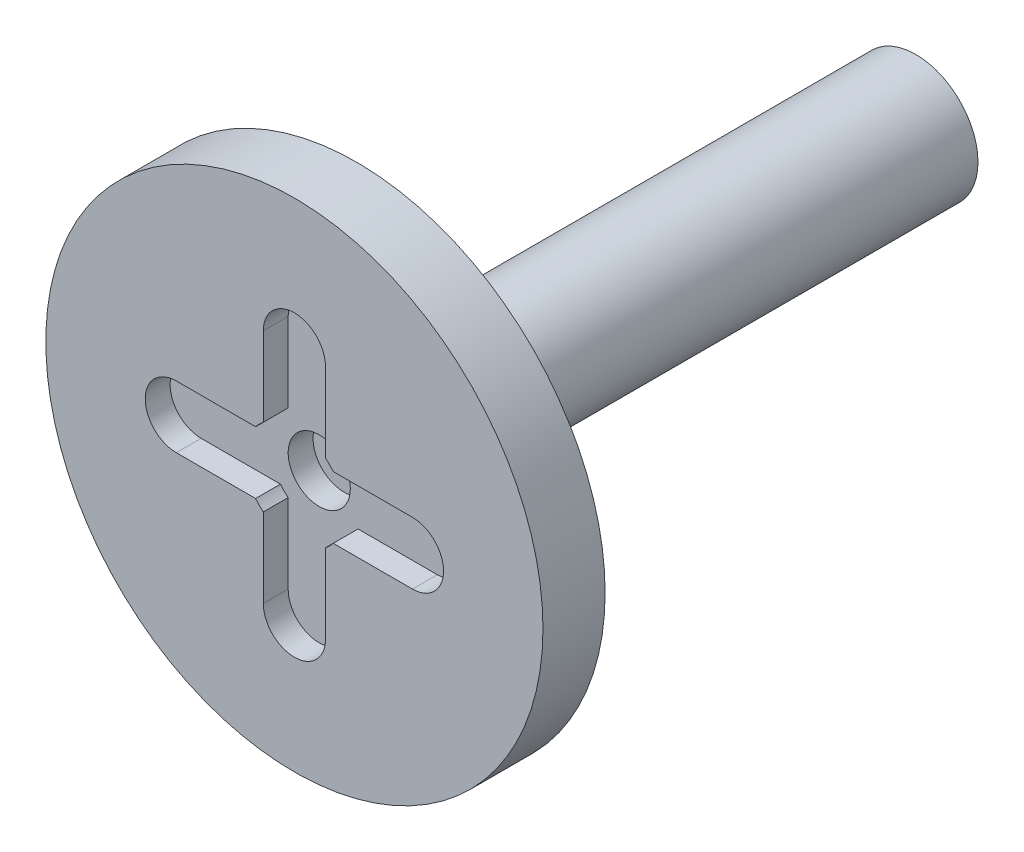
ISO-10303-21;
HEADER;
FILE_DESCRIPTION(('STEP AP214'),'2;1');
FILE_NAME('part.step','',(''),(''),'','','');
FILE_SCHEMA(('AUTOMOTIVE_DESIGN { 1 0 10303 214 1 1 1 1 }'));
ENDSEC;
DATA;
#1=APPLICATION_CONTEXT('core data for automotive mechanical design processes');
#2=APPLICATION_PROTOCOL_DEFINITION('international standard','automotive_design',2000,#1);
#3=PRODUCT_CONTEXT('',#1,'mechanical');
#4=PRODUCT('Part','Part','',(#3));
#5=PRODUCT_RELATED_PRODUCT_CATEGORY('part','',(#4));
#6=PRODUCT_DEFINITION_FORMATION('','',#4);
#7=PRODUCT_DEFINITION_CONTEXT('part definition',#1,'design');
#8=PRODUCT_DEFINITION('design','',#6,#7);
#9=PRODUCT_DEFINITION_SHAPE('','',#8);
#10=(LENGTH_UNIT() NAMED_UNIT(*) SI_UNIT(.MILLI.,.METRE.));
#11=(NAMED_UNIT(*) PLANE_ANGLE_UNIT() SI_UNIT($,.RADIAN.));
#12=(NAMED_UNIT(*) SI_UNIT($,.STERADIAN.) SOLID_ANGLE_UNIT());
#13=UNCERTAINTY_MEASURE_WITH_UNIT(LENGTH_MEASURE(1.E-05),#10,'distance_accuracy_value','');
#14=(GEOMETRIC_REPRESENTATION_CONTEXT(3) GLOBAL_UNCERTAINTY_ASSIGNED_CONTEXT((#13)) GLOBAL_UNIT_ASSIGNED_CONTEXT((#10,
#11,#12)) REPRESENTATION_CONTEXT('',''));
#15=CARTESIAN_POINT('',(0.,0.,0.));
#16=DIRECTION('',(0.,0.,1.));
#17=DIRECTION('',(1.,0.,0.));
#18=AXIS2_PLACEMENT_3D('',#15,#16,#17);
#19=CARTESIAN_POINT('',(0.,0.,-4.));
#20=DIRECTION('',(0.,0.,1.));
#21=DIRECTION('',(1.,0.,0.));
#22=AXIS2_PLACEMENT_3D('',#19,#20,#21);
#23=PLANE('',#22);
#24=CARTESIAN_POINT('',(0.,0.,-4.));
#25=DIRECTION('',(0.,0.,1.));
#26=DIRECTION('',(1.,0.,0.));
#27=AXIS2_PLACEMENT_3D('',#24,#25,#26);
#28=CIRCLE('',#27,2.5);
#29=CARTESIAN_POINT('',(2.5,0.,-4.));
#30=VERTEX_POINT('',#29);
#31=EDGE_CURVE('E20',#30,#30,#28,.T.);
#32=ORIENTED_EDGE('',*,*,#31,.T.);
#33=EDGE_LOOP('',(#32));
#34=FACE_BOUND('',#33,.T.);
#35=ADVANCED_FACE('F17',(#34),#23,.T.);
#36=CARTESIAN_POINT('',(0.,0.,-4.));
#37=DIRECTION('',(0.,0.,1.));
#38=DIRECTION('',(1.,0.,0.));
#39=AXIS2_PLACEMENT_3D('',#36,#37,#38);
#40=CYLINDRICAL_SURFACE('',#39,2.5);
#41=CARTESIAN_POINT('',(0.,0.,-2.));
#42=DIRECTION('',(0.,0.,1.));
#43=DIRECTION('',(1.,0.,0.));
#44=AXIS2_PLACEMENT_3D('',#41,#42,#43);
#45=CIRCLE('',#44,2.5);
#46=CARTESIAN_POINT('',(2.5,0.,-2.));
#47=VERTEX_POINT('',#46);
#48=EDGE_CURVE('E383',#47,#47,#45,.F.);
#49=ORIENTED_EDGE('',*,*,#48,.F.);
#50=EDGE_LOOP('',(#49));
#51=FACE_BOUND('',#50,.T.);
#52=ORIENTED_EDGE('',*,*,#31,.F.);
#53=EDGE_LOOP('',(#52));
#54=FACE_BOUND('',#53,.T.);
#55=ADVANCED_FACE('F783',(#51,#54),#40,.F.);
#56=CARTESIAN_POINT('',(0.,0.,-2.));
#57=DIRECTION('',(0.,0.,1.));
#58=DIRECTION('',(1.,0.,0.));
#59=AXIS2_PLACEMENT_3D('',#56,#57,#58);
#60=CYLINDRICAL_SURFACE('',#59,4.);
#61=DIRECTION('',(0.,0.,1.));
#62=VECTOR('',#61,1.);
#63=CARTESIAN_POINT('',(3.12249899919919,-2.50000000000001,-2.));
#64=LINE('',#63,#62);
#65=CARTESIAN_POINT('',(3.12249899919918,-2.50000000000002,0.));
#66=VERTEX_POINT('',#65);
#67=CARTESIAN_POINT('',(3.12249899919919,-2.50000000000001,-2.));
#68=VERTEX_POINT('',#67);
#69=EDGE_CURVE('E300',#66,#68,#64,.F.);
#70=ORIENTED_EDGE('',*,*,#69,.T.);
#71=CARTESIAN_POINT('',(0.,0.,-2.));
#72=DIRECTION('',(0.,0.,1.));
#73=DIRECTION('',(1.,0.,0.));
#74=AXIS2_PLACEMENT_3D('',#71,#72,#73);
#75=CIRCLE('',#74,4.);
#76=CARTESIAN_POINT('',(2.49999999999998,-3.12249899919922,-2.));
#77=VERTEX_POINT('',#76);
#78=EDGE_CURVE('E173',#77,#68,#75,.T.);
#79=ORIENTED_EDGE('',*,*,#78,.F.);
#80=DIRECTION('',(0.,0.,1.));
#81=VECTOR('',#80,1.);
#82=CARTESIAN_POINT('',(2.49999999999998,-3.12249899919922,-2.));
#83=LINE('',#82,#81);
#84=CARTESIAN_POINT('',(2.49999999999998,-3.12249899919922,0.));
#85=VERTEX_POINT('',#84);
#86=EDGE_CURVE('E171',#85,#77,#83,.F.);
#87=ORIENTED_EDGE('',*,*,#86,.F.);
#88=CARTESIAN_POINT('',(0.,0.,0.));
#89=DIRECTION('',(0.,0.,1.));
#90=DIRECTION('',(1.,0.,0.));
#91=AXIS2_PLACEMENT_3D('',#88,#89,#90);
#92=CIRCLE('',#91,4.);
#93=EDGE_CURVE('E156',#66,#85,#92,.F.);
#94=ORIENTED_EDGE('',*,*,#93,.F.);
#95=EDGE_LOOP('',(#70,#79,#87,#94));
#96=FACE_BOUND('',#95,.T.);
#97=ADVANCED_FACE('F172',(#96),#60,.F.);
#98=CARTESIAN_POINT('',(0.,0.,-2.));
#99=DIRECTION('',(0.,0.,1.));
#100=DIRECTION('',(1.,0.,0.));
#101=AXIS2_PLACEMENT_3D('',#98,#99,#100);
#102=CYLINDRICAL_SURFACE('',#101,4.);
#103=DIRECTION('',(0.,0.,-1.));
#104=VECTOR('',#103,1.);
#105=CARTESIAN_POINT('',(-2.5,-3.1224989991992,-2.));
#106=LINE('',#105,#104);
#107=CARTESIAN_POINT('',(-2.5,-3.1224989991992,-2.));
#108=VERTEX_POINT('',#107);
#109=CARTESIAN_POINT('',(-2.5,-3.1224989991992,0.));
#110=VERTEX_POINT('',#109);
#111=EDGE_CURVE('E291',#108,#110,#106,.F.);
#112=ORIENTED_EDGE('',*,*,#111,.F.);
#113=CARTESIAN_POINT('',(0.,0.,-2.));
#114=DIRECTION('',(0.,0.,1.));
#115=DIRECTION('',(1.,0.,0.));
#116=AXIS2_PLACEMENT_3D('',#113,#114,#115);
#117=CIRCLE('',#116,4.);
#118=CARTESIAN_POINT('',(-3.12249899919921,-2.49999999999999,-2.));
#119=VERTEX_POINT('',#118);
#120=EDGE_CURVE('E303',#119,#108,#117,.T.);
#121=ORIENTED_EDGE('',*,*,#120,.F.);
#122=DIRECTION('',(0.,0.,1.));
#123=VECTOR('',#122,1.);
#124=CARTESIAN_POINT('',(-3.12249899919921,-2.49999999999999,-2.));
#125=LINE('',#124,#123);
#126=CARTESIAN_POINT('',(-3.12249899919921,-2.49999999999999,0.));
#127=VERTEX_POINT('',#126);
#128=EDGE_CURVE('E288',#119,#127,#125,.T.);
#129=ORIENTED_EDGE('',*,*,#128,.T.);
#130=CARTESIAN_POINT('',(0.,0.,0.));
#131=DIRECTION('',(0.,0.,1.));
#132=DIRECTION('',(1.,0.,0.));
#133=AXIS2_PLACEMENT_3D('',#130,#131,#132);
#134=CIRCLE('',#133,4.);
#135=EDGE_CURVE('E169',#110,#127,#134,.F.);
#136=ORIENTED_EDGE('',*,*,#135,.F.);
#137=EDGE_LOOP('',(#112,#121,#129,#136));
#138=FACE_BOUND('',#137,.T.);
#139=ADVANCED_FACE('F397',(#138),#102,.F.);
#140=CARTESIAN_POINT('',(0.,0.,-2.));
#141=DIRECTION('',(0.,0.,1.));
#142=DIRECTION('',(1.,0.,0.));
#143=AXIS2_PLACEMENT_3D('',#140,#141,#142);
#144=CYLINDRICAL_SURFACE('',#143,4.);
#145=DIRECTION('',(0.,0.,1.));
#146=VECTOR('',#145,1.);
#147=CARTESIAN_POINT('',(-3.12249899919919,2.50000000000001,-2.));
#148=LINE('',#147,#146);
#149=CARTESIAN_POINT('',(-3.12249899919919,2.50000000000001,-2.));
#150=VERTEX_POINT('',#149);
#151=CARTESIAN_POINT('',(-3.12249899919918,2.50000000000002,0.));
#152=VERTEX_POINT('',#151);
#153=EDGE_CURVE('E281',#150,#152,#148,.T.);
#154=ORIENTED_EDGE('',*,*,#153,.F.);
#155=CARTESIAN_POINT('',(0.,0.,-2.));
#156=DIRECTION('',(0.,0.,1.));
#157=DIRECTION('',(1.,0.,0.));
#158=AXIS2_PLACEMENT_3D('',#155,#156,#157);
#159=CIRCLE('',#158,4.);
#160=CARTESIAN_POINT('',(-2.5,3.1224989991992,-2.));
#161=VERTEX_POINT('',#160);
#162=EDGE_CURVE('E378',#161,#150,#159,.T.);
#163=ORIENTED_EDGE('',*,*,#162,.F.);
#164=DIRECTION('',(0.,0.,-1.));
#165=VECTOR('',#164,1.);
#166=CARTESIAN_POINT('',(-2.5,3.1224989991992,-2.));
#167=LINE('',#166,#165);
#168=CARTESIAN_POINT('',(-2.5,3.1224989991992,0.));
#169=VERTEX_POINT('',#168);
#170=EDGE_CURVE('E272',#169,#161,#167,.T.);
#171=ORIENTED_EDGE('',*,*,#170,.F.);
#172=CARTESIAN_POINT('',(0.,0.,0.));
#173=DIRECTION('',(0.,0.,1.));
#174=DIRECTION('',(1.,0.,0.));
#175=AXIS2_PLACEMENT_3D('',#172,#173,#174);
#176=CIRCLE('',#175,4.);
#177=EDGE_CURVE('E388',#152,#169,#176,.F.);
#178=ORIENTED_EDGE('',*,*,#177,.F.);
#179=EDGE_LOOP('',(#154,#163,#171,#178));
#180=FACE_BOUND('',#179,.T.);
#181=ADVANCED_FACE('F440',(#180),#144,.F.);
#182=CARTESIAN_POINT('',(0.,0.,-2.));
#183=DIRECTION('',(0.,0.,1.));
#184=DIRECTION('',(1.,0.,0.));
#185=AXIS2_PLACEMENT_3D('',#182,#183,#184);
#186=CYLINDRICAL_SURFACE('',#185,4.);
#187=DIRECTION('',(0.,0.,1.));
#188=VECTOR('',#187,1.);
#189=CARTESIAN_POINT('',(2.50000000000002,3.12249899919918,-2.));
#190=LINE('',#189,#188);
#191=CARTESIAN_POINT('',(2.50000000000002,3.12249899919918,-2.));
#192=VERTEX_POINT('',#191);
#193=CARTESIAN_POINT('',(2.50000000000004,3.12249899919916,0.));
#194=VERTEX_POINT('',#193);
#195=EDGE_CURVE('E266',#192,#194,#190,.T.);
#196=ORIENTED_EDGE('',*,*,#195,.F.);
#197=CARTESIAN_POINT('',(0.,0.,-2.));
#198=DIRECTION('',(0.,0.,1.));
#199=DIRECTION('',(1.,0.,0.));
#200=AXIS2_PLACEMENT_3D('',#197,#198,#199);
#201=CIRCLE('',#200,4.);
#202=CARTESIAN_POINT('',(3.12249899919921,2.49999999999999,-2.));
#203=VERTEX_POINT('',#202);
#204=EDGE_CURVE('E380',#203,#192,#201,.T.);
#205=ORIENTED_EDGE('',*,*,#204,.F.);
#206=DIRECTION('',(0.,0.,1.));
#207=VECTOR('',#206,1.);
#208=CARTESIAN_POINT('',(3.12249899919921,2.49999999999999,-2.));
#209=LINE('',#208,#207);
#210=CARTESIAN_POINT('',(3.12249899919921,2.49999999999999,0.));
#211=VERTEX_POINT('',#210);
#212=EDGE_CURVE('E257',#211,#203,#209,.F.);
#213=ORIENTED_EDGE('',*,*,#212,.F.);
#214=CARTESIAN_POINT('',(0.,0.,0.));
#215=DIRECTION('',(0.,0.,1.));
#216=DIRECTION('',(1.,0.,0.));
#217=AXIS2_PLACEMENT_3D('',#214,#215,#216);
#218=CIRCLE('',#217,4.);
#219=EDGE_CURVE('E386',#194,#211,#218,.F.);
#220=ORIENTED_EDGE('',*,*,#219,.F.);
#221=EDGE_LOOP('',(#196,#205,#213,#220));
#222=FACE_BOUND('',#221,.T.);
#223=ADVANCED_FACE('F455',(#222),#186,.F.);
#224=CARTESIAN_POINT('',(0.,0.,-2.));
#225=DIRECTION('',(0.,0.,1.));
#226=DIRECTION('',(1.,0.,0.));
#227=AXIS2_PLACEMENT_3D('',#224,#225,#226);
#228=PLANE('',#227);
#229=ORIENTED_EDGE('',*,*,#120,.T.);
#230=DIRECTION('',(0.,1.,0.));
#231=VECTOR('',#230,1.);
#232=CARTESIAN_POINT('',(-2.5,0.,-2.));
#233=LINE('',#232,#231);
#234=CARTESIAN_POINT('',(-2.5,-9.5,-2.));
#235=VERTEX_POINT('',#234);
#236=EDGE_CURVE('E295',#235,#108,#233,.T.);
#237=ORIENTED_EDGE('',*,*,#236,.F.);
#238=CARTESIAN_POINT('',(0.,-9.5,-2.));
#239=DIRECTION('',(0.,0.,1.));
#240=DIRECTION('',(1.,0.,0.));
#241=AXIS2_PLACEMENT_3D('',#238,#239,#240);
#242=CIRCLE('',#241,2.5);
#243=CARTESIAN_POINT('',(2.49999999999993,-9.50000000000001,-2.));
#244=VERTEX_POINT('',#243);
#245=EDGE_CURVE('E296',#235,#244,#242,.T.);
#246=ORIENTED_EDGE('',*,*,#245,.T.);
#247=DIRECTION('',(0.,-1.,0.));
#248=VECTOR('',#247,1.);
#249=CARTESIAN_POINT('',(2.5,0.,-2.));
#250=LINE('',#249,#248);
#251=EDGE_CURVE('E178',#77,#244,#250,.T.);
#252=ORIENTED_EDGE('',*,*,#251,.F.);
#253=ORIENTED_EDGE('',*,*,#78,.T.);
#254=DIRECTION('',(1.,0.,0.));
#255=VECTOR('',#254,1.);
#256=CARTESIAN_POINT('',(0.,-2.5,-2.));
#257=LINE('',#256,#255);
#258=CARTESIAN_POINT('',(9.49999999999999,-2.50000000000003,-2.));
#259=VERTEX_POINT('',#258);
#260=EDGE_CURVE('E302',#68,#259,#257,.T.);
#261=ORIENTED_EDGE('',*,*,#260,.T.);
#262=CARTESIAN_POINT('',(9.5,0.,-2.));
#263=DIRECTION('',(0.,0.,1.));
#264=DIRECTION('',(1.,0.,0.));
#265=AXIS2_PLACEMENT_3D('',#262,#263,#264);
#266=CIRCLE('',#265,2.5);
#267=CARTESIAN_POINT('',(9.50000000000001,2.49999999999997,-2.));
#268=VERTEX_POINT('',#267);
#269=EDGE_CURVE('E253',#259,#268,#266,.T.);
#270=ORIENTED_EDGE('',*,*,#269,.T.);
#271=DIRECTION('',(1.,0.,0.));
#272=VECTOR('',#271,1.);
#273=CARTESIAN_POINT('',(0.,2.5,-2.));
#274=LINE('',#273,#272);
#275=EDGE_CURVE('E260',#203,#268,#274,.T.);
#276=ORIENTED_EDGE('',*,*,#275,.F.);
#277=ORIENTED_EDGE('',*,*,#204,.T.);
#278=DIRECTION('',(0.,-1.,0.));
#279=VECTOR('',#278,1.);
#280=CARTESIAN_POINT('',(2.5,0.,-2.));
#281=LINE('',#280,#279);
#282=CARTESIAN_POINT('',(2.50000000000007,9.49999999999998,-2.));
#283=VERTEX_POINT('',#282);
#284=EDGE_CURVE('E264',#283,#192,#281,.T.);
#285=ORIENTED_EDGE('',*,*,#284,.F.);
#286=CARTESIAN_POINT('',(0.,9.5,-2.));
#287=DIRECTION('',(0.,0.,-1.));
#288=DIRECTION('',(-1.,0.,0.));
#289=AXIS2_PLACEMENT_3D('',#286,#287,#288);
#290=CIRCLE('',#289,2.5);
#291=CARTESIAN_POINT('',(-2.5,9.5,-2.));
#292=VERTEX_POINT('',#291);
#293=EDGE_CURVE('E265',#283,#292,#290,.F.);
#294=ORIENTED_EDGE('',*,*,#293,.T.);
#295=DIRECTION('',(0.,1.,0.));
#296=VECTOR('',#295,1.);
#297=CARTESIAN_POINT('',(-2.5,0.,-2.));
#298=LINE('',#297,#296);
#299=EDGE_CURVE('E275',#161,#292,#298,.T.);
#300=ORIENTED_EDGE('',*,*,#299,.F.);
#301=ORIENTED_EDGE('',*,*,#162,.T.);
#302=DIRECTION('',(1.,0.,0.));
#303=VECTOR('',#302,1.);
#304=CARTESIAN_POINT('',(0.,2.5,-2.));
#305=LINE('',#304,#303);
#306=CARTESIAN_POINT('',(-9.49999999999999,2.50000000000003,-2.));
#307=VERTEX_POINT('',#306);
#308=EDGE_CURVE('E279',#307,#150,#305,.T.);
#309=ORIENTED_EDGE('',*,*,#308,.F.);
#310=CARTESIAN_POINT('',(-9.5,0.,-2.));
#311=DIRECTION('',(0.,0.,1.));
#312=DIRECTION('',(1.,0.,0.));
#313=AXIS2_PLACEMENT_3D('',#310,#311,#312);
#314=CIRCLE('',#313,2.5);
#315=CARTESIAN_POINT('',(-9.50000000000001,-2.49999999999997,-2.));
#316=VERTEX_POINT('',#315);
#317=EDGE_CURVE('E280',#307,#316,#314,.T.);
#318=ORIENTED_EDGE('',*,*,#317,.T.);
#319=DIRECTION('',(1.,0.,0.));
#320=VECTOR('',#319,1.);
#321=CARTESIAN_POINT('',(0.,-2.5,-2.));
#322=LINE('',#321,#320);
#323=EDGE_CURVE('E287',#316,#119,#322,.T.);
#324=ORIENTED_EDGE('',*,*,#323,.T.);
#325=EDGE_LOOP('',(#229,#237,#246,#252,#253,#261,#270,#276,#277,#285,#294,#300,#301,#309,#318,#324));
#326=FACE_BOUND('',#325,.T.);
#327=ORIENTED_EDGE('',*,*,#48,.T.);
#328=EDGE_LOOP('',(#327));
#329=FACE_BOUND('',#328,.T.);
#330=ADVANCED_FACE('F422',(#326,#329),#228,.T.);
#331=CARTESIAN_POINT('',(0.,0.,0.));
#332=DIRECTION('',(-0.951056516295154,0.309016994374947,0.));
#333=DIRECTION('',(-0.309016994374947,-0.951056516295154,0.));
#334=AXIS2_PLACEMENT_3D('',#331,#332,#333);
#335=PLANE('',#334);
#336=DIRECTION('',(0.,0.,1.));
#337=VECTOR('',#336,1.);
#338=CARTESIAN_POINT('',(0.772542485937375,2.37764129073789,-32.));
#339=LINE('',#338,#337);
#340=CARTESIAN_POINT('',(0.772542485937375,2.37764129073789,-32.));
#341=VERTEX_POINT('',#340);
#342=CARTESIAN_POINT('',(0.772542485937375,2.37764129073789,-37.));
#343=VERTEX_POINT('',#342);
#344=EDGE_CURVE('E233',#341,#343,#339,.F.);
#345=ORIENTED_EDGE('',*,*,#344,.T.);
#346=DIRECTION('',(-0.309016994374947,-0.951056516295154,0.));
#347=VECTOR('',#346,1.);
#348=CARTESIAN_POINT('',(0.772542485937375,2.37764129073789,-37.));
#349=LINE('',#348,#347);
#350=CARTESIAN_POINT('',(-0.772542485937361,-2.37764129073788,-37.));
#351=VERTEX_POINT('',#350);
#352=EDGE_CURVE('E239',#343,#351,#349,.T.);
#353=ORIENTED_EDGE('',*,*,#352,.T.);
#354=DIRECTION('',(0.,0.,1.));
#355=VECTOR('',#354,1.);
#356=CARTESIAN_POINT('',(-0.772542485937361,-2.37764129073788,-37.));
#357=LINE('',#356,#355);
#358=CARTESIAN_POINT('',(-0.772542485937361,-2.37764129073788,-32.));
#359=VERTEX_POINT('',#358);
#360=EDGE_CURVE('E315',#351,#359,#357,.T.);
#361=ORIENTED_EDGE('',*,*,#360,.T.);
#362=DIRECTION('',(0.309016994374947,0.951056516295154,0.));
#363=VECTOR('',#362,1.);
#364=CARTESIAN_POINT('',(-0.772542485937361,-2.37764129073788,-32.));
#365=LINE('',#364,#363);
#366=EDGE_CURVE('E218',#359,#341,#365,.T.);
#367=ORIENTED_EDGE('',*,*,#366,.T.);
#368=EDGE_LOOP('',(#345,#353,#361,#367));
#369=FACE_BOUND('',#368,.T.);
#370=ADVANCED_FACE('F463',(#369),#335,.T.);
#371=CARTESIAN_POINT('',(0.,0.,0.));
#372=DIRECTION('',(-1.,0.,0.));
#373=DIRECTION('',(0.,0.,1.));
#374=AXIS2_PLACEMENT_3D('',#371,#372,#373);
#375=PLANE('',#374);
#376=DIRECTION('',(0.,0.,1.));
#377=VECTOR('',#376,1.);
#378=CARTESIAN_POINT('',(0.,2.5,-15.));
#379=LINE('',#378,#377);
#380=CARTESIAN_POINT('',(0.,2.5,-15.));
#381=VERTEX_POINT('',#380);
#382=CARTESIAN_POINT('',(0.,2.5,-20.));
#383=VERTEX_POINT('',#382);
#384=EDGE_CURVE('E206',#381,#383,#379,.F.);
#385=ORIENTED_EDGE('',*,*,#384,.T.);
#386=DIRECTION('',(0.,1.,0.));
#387=VECTOR('',#386,1.);
#388=CARTESIAN_POINT('',(0.,2.5,-20.));
#389=LINE('',#388,#387);
#390=CARTESIAN_POINT('',(0.,-2.5,-20.));
#391=VERTEX_POINT('',#390);
#392=EDGE_CURVE('E212',#383,#391,#389,.F.);
#393=ORIENTED_EDGE('',*,*,#392,.T.);
#394=DIRECTION('',(0.,0.,-1.));
#395=VECTOR('',#394,1.);
#396=CARTESIAN_POINT('',(0.,-2.5,-20.));
#397=LINE('',#396,#395);
#398=CARTESIAN_POINT('',(0.,-2.5,-15.));
#399=VERTEX_POINT('',#398);
#400=EDGE_CURVE('E312',#391,#399,#397,.F.);
#401=ORIENTED_EDGE('',*,*,#400,.T.);
#402=DIRECTION('',(0.,1.,0.));
#403=VECTOR('',#402,1.);
#404=CARTESIAN_POINT('',(0.,-2.5,-15.));
#405=LINE('',#404,#403);
#406=EDGE_CURVE('E192',#399,#381,#405,.T.);
#407=ORIENTED_EDGE('',*,*,#406,.T.);
#408=EDGE_LOOP('',(#385,#393,#401,#407));
#409=FACE_BOUND('',#408,.T.);
#410=ADVANCED_FACE('F546',(#409),#375,.T.);
#411=CARTESIAN_POINT('',(0.,-2.5,-2.));
#412=DIRECTION('',(0.,-1.,0.));
#413=DIRECTION('',(1.,0.,0.));
#414=AXIS2_PLACEMENT_3D('',#411,#412,#413);
#415=PLANE('',#414);
#416=DIRECTION('',(0.,0.,1.));
#417=VECTOR('',#416,1.);
#418=CARTESIAN_POINT('',(9.49999999999999,-2.50000000000003,-2.));
#419=LINE('',#418,#417);
#420=CARTESIAN_POINT('',(9.5,-2.50000000000003,0.));
#421=VERTEX_POINT('',#420);
#422=EDGE_CURVE('E250',#421,#259,#419,.F.);
#423=ORIENTED_EDGE('',*,*,#422,.T.);
#424=ORIENTED_EDGE('',*,*,#260,.F.);
#425=ORIENTED_EDGE('',*,*,#69,.F.);
#426=DIRECTION('',(1.,0.,0.));
#427=VECTOR('',#426,1.);
#428=CARTESIAN_POINT('',(0.,-2.50000000000003,0.));
#429=LINE('',#428,#427);
#430=EDGE_CURVE('E168',#421,#66,#429,.F.);
#431=ORIENTED_EDGE('',*,*,#430,.F.);
#432=EDGE_LOOP('',(#423,#424,#425,#431));
#433=FACE_BOUND('',#432,.T.);
#434=ADVANCED_FACE('F420',(#433),#415,.F.);
#435=CARTESIAN_POINT('',(2.5,0.,-2.));
#436=DIRECTION('',(-1.,0.,0.));
#437=DIRECTION('',(0.,-1.,0.));
#438=AXIS2_PLACEMENT_3D('',#435,#436,#437);
#439=PLANE('',#438);
#440=DIRECTION('',(0.,1.,0.));
#441=VECTOR('',#440,1.);
#442=CARTESIAN_POINT('',(2.49999999999998,0.,0.));
#443=LINE('',#442,#441);
#444=CARTESIAN_POINT('',(2.49999999999996,-9.5,0.));
#445=VERTEX_POINT('',#444);
#446=EDGE_CURVE('E164',#85,#445,#443,.F.);
#447=ORIENTED_EDGE('',*,*,#446,.F.);
#448=ORIENTED_EDGE('',*,*,#86,.T.);
#449=ORIENTED_EDGE('',*,*,#251,.T.);
#450=DIRECTION('',(0.,0.,1.));
#451=VECTOR('',#450,1.);
#452=CARTESIAN_POINT('',(2.49999999999993,-9.5,-2.));
#453=LINE('',#452,#451);
#454=EDGE_CURVE('E177',#244,#445,#453,.T.);
#455=ORIENTED_EDGE('',*,*,#454,.T.);
#456=EDGE_LOOP('',(#447,#448,#449,#455));
#457=FACE_BOUND('',#456,.T.);
#458=ADVANCED_FACE('F180',(#457),#439,.T.);
#459=CARTESIAN_POINT('',(0.,-9.5,-2.));
#460=DIRECTION('',(0.,0.,1.));
#461=DIRECTION('',(1.,0.,0.));
#462=AXIS2_PLACEMENT_3D('',#459,#460,#461);
#463=CYLINDRICAL_SURFACE('',#462,2.5);
#464=ORIENTED_EDGE('',*,*,#245,.F.);
#465=DIRECTION('',(0.,0.,-1.));
#466=VECTOR('',#465,1.);
#467=CARTESIAN_POINT('',(-2.5,-9.5,-2.));
#468=LINE('',#467,#466);
#469=CARTESIAN_POINT('',(-2.5,-9.5,0.));
#470=VERTEX_POINT('',#469);
#471=EDGE_CURVE('E292',#470,#235,#468,.T.);
#472=ORIENTED_EDGE('',*,*,#471,.F.);
#473=CARTESIAN_POINT('',(0.,-9.5,0.));
#474=DIRECTION('',(0.,0.,1.));
#475=DIRECTION('',(1.,0.,0.));
#476=AXIS2_PLACEMENT_3D('',#473,#474,#475);
#477=CIRCLE('',#476,2.5);
#478=EDGE_CURVE('E182',#445,#470,#477,.F.);
#479=ORIENTED_EDGE('',*,*,#478,.F.);
#480=ORIENTED_EDGE('',*,*,#454,.F.);
#481=EDGE_LOOP('',(#464,#472,#479,#480));
#482=FACE_BOUND('',#481,.T.);
#483=ADVANCED_FACE('F426',(#482),#463,.F.);
#484=CARTESIAN_POINT('',(-2.5,0.,-2.));
#485=DIRECTION('',(1.,0.,0.));
#486=DIRECTION('',(0.,0.,-1.));
#487=AXIS2_PLACEMENT_3D('',#484,#485,#486);
#488=PLANE('',#487);
#489=ORIENTED_EDGE('',*,*,#236,.T.);
#490=ORIENTED_EDGE('',*,*,#111,.T.);
#491=DIRECTION('',(0.,1.,0.));
#492=VECTOR('',#491,1.);
#493=CARTESIAN_POINT('',(-2.5,0.,0.));
#494=LINE('',#493,#492);
#495=EDGE_CURVE('E184',#470,#110,#494,.T.);
#496=ORIENTED_EDGE('',*,*,#495,.F.);
#497=ORIENTED_EDGE('',*,*,#471,.T.);
#498=EDGE_LOOP('',(#489,#490,#496,#497));
#499=FACE_BOUND('',#498,.T.);
#500=ADVANCED_FACE('F429',(#499),#488,.T.);
#501=CARTESIAN_POINT('',(0.,-2.5,-2.));
#502=DIRECTION('',(0.,-1.,0.));
#503=DIRECTION('',(1.,0.,0.));
#504=AXIS2_PLACEMENT_3D('',#501,#502,#503);
#505=PLANE('',#504);
#506=DIRECTION('',(0.,0.,-1.));
#507=VECTOR('',#506,1.);
#508=CARTESIAN_POINT('',(-9.50000000000001,-2.49999999999997,-2.));
#509=LINE('',#508,#507);
#510=CARTESIAN_POINT('',(-9.5,-2.49999999999998,0.));
#511=VERTEX_POINT('',#510);
#512=EDGE_CURVE('E284',#316,#511,#509,.F.);
#513=ORIENTED_EDGE('',*,*,#512,.T.);
#514=DIRECTION('',(1.,0.,0.));
#515=VECTOR('',#514,1.);
#516=CARTESIAN_POINT('',(0.,-2.49999999999999,0.));
#517=LINE('',#516,#515);
#518=EDGE_CURVE('E371',#127,#511,#517,.F.);
#519=ORIENTED_EDGE('',*,*,#518,.F.);
#520=ORIENTED_EDGE('',*,*,#128,.F.);
#521=ORIENTED_EDGE('',*,*,#323,.F.);
#522=EDGE_LOOP('',(#513,#519,#520,#521));
#523=FACE_BOUND('',#522,.T.);
#524=ADVANCED_FACE('F400',(#523),#505,.F.);
#525=CARTESIAN_POINT('',(-9.5,0.,-2.));
#526=DIRECTION('',(0.,0.,1.));
#527=DIRECTION('',(1.,0.,0.));
#528=AXIS2_PLACEMENT_3D('',#525,#526,#527);
#529=CYLINDRICAL_SURFACE('',#528,2.5);
#530=ORIENTED_EDGE('',*,*,#317,.F.);
#531=DIRECTION('',(0.,0.,1.));
#532=VECTOR('',#531,1.);
#533=CARTESIAN_POINT('',(-9.49999999999999,2.50000000000003,-2.));
#534=LINE('',#533,#532);
#535=CARTESIAN_POINT('',(-9.49999999999999,2.50000000000003,0.));
#536=VERTEX_POINT('',#535);
#537=EDGE_CURVE('E276',#536,#307,#534,.F.);
#538=ORIENTED_EDGE('',*,*,#537,.F.);
#539=CARTESIAN_POINT('',(-9.5,0.,0.));
#540=DIRECTION('',(0.,0.,1.));
#541=DIRECTION('',(1.,0.,0.));
#542=AXIS2_PLACEMENT_3D('',#539,#540,#541);
#543=CIRCLE('',#542,2.5);
#544=EDGE_CURVE('E369',#511,#536,#543,.F.);
#545=ORIENTED_EDGE('',*,*,#544,.F.);
#546=ORIENTED_EDGE('',*,*,#512,.F.);
#547=EDGE_LOOP('',(#530,#538,#545,#546));
#548=FACE_BOUND('',#547,.T.);
#549=ADVANCED_FACE('F432',(#548),#529,.F.);
#550=CARTESIAN_POINT('',(0.,2.5,-2.));
#551=DIRECTION('',(0.,-1.,0.));
#552=DIRECTION('',(1.,0.,0.));
#553=AXIS2_PLACEMENT_3D('',#550,#551,#552);
#554=PLANE('',#553);
#555=ORIENTED_EDGE('',*,*,#308,.T.);
#556=ORIENTED_EDGE('',*,*,#153,.T.);
#557=DIRECTION('',(1.,0.,0.));
#558=VECTOR('',#557,1.);
#559=CARTESIAN_POINT('',(0.,2.50000000000003,0.));
#560=LINE('',#559,#558);
#561=EDGE_CURVE('E370',#536,#152,#560,.T.);
#562=ORIENTED_EDGE('',*,*,#561,.F.);
#563=ORIENTED_EDGE('',*,*,#537,.T.);
#564=EDGE_LOOP('',(#555,#556,#562,#563));
#565=FACE_BOUND('',#564,.T.);
#566=ADVANCED_FACE('F437',(#565),#554,.T.);
#567=CARTESIAN_POINT('',(-2.5,0.,-2.));
#568=DIRECTION('',(1.,0.,0.));
#569=DIRECTION('',(0.,0.,-1.));
#570=AXIS2_PLACEMENT_3D('',#567,#568,#569);
#571=PLANE('',#570);
#572=DIRECTION('',(0.,1.,0.));
#573=VECTOR('',#572,1.);
#574=CARTESIAN_POINT('',(-2.5,0.,0.));
#575=LINE('',#574,#573);
#576=CARTESIAN_POINT('',(-2.5,9.5,0.));
#577=VERTEX_POINT('',#576);
#578=EDGE_CURVE('E368',#169,#577,#575,.T.);
#579=ORIENTED_EDGE('',*,*,#578,.F.);
#580=ORIENTED_EDGE('',*,*,#170,.T.);
#581=ORIENTED_EDGE('',*,*,#299,.T.);
#582=DIRECTION('',(0.,0.,-1.));
#583=VECTOR('',#582,1.);
#584=CARTESIAN_POINT('',(-2.5,9.5,-2.));
#585=LINE('',#584,#583);
#586=EDGE_CURVE('E269',#292,#577,#585,.F.);
#587=ORIENTED_EDGE('',*,*,#586,.T.);
#588=EDGE_LOOP('',(#579,#580,#581,#587));
#589=FACE_BOUND('',#588,.T.);
#590=ADVANCED_FACE('F444',(#589),#571,.T.);
#591=CARTESIAN_POINT('',(0.,9.5,-2.));
#592=DIRECTION('',(0.,0.,-1.));
#593=DIRECTION('',(-1.,0.,0.));
#594=AXIS2_PLACEMENT_3D('',#591,#592,#593);
#595=CYLINDRICAL_SURFACE('',#594,2.5);
#596=DIRECTION('',(0.,0.,1.));
#597=VECTOR('',#596,1.);
#598=CARTESIAN_POINT('',(2.50000000000007,9.49999999999998,-2.));
#599=LINE('',#598,#597);
#600=CARTESIAN_POINT('',(2.50000000000007,9.49999999999999,0.));
#601=VERTEX_POINT('',#600);
#602=EDGE_CURVE('E261',#601,#283,#599,.F.);
#603=ORIENTED_EDGE('',*,*,#602,.F.);
#604=CARTESIAN_POINT('',(0.,9.5,0.));
#605=DIRECTION('',(0.,0.,-1.));
#606=DIRECTION('',(-1.,0.,0.));
#607=AXIS2_PLACEMENT_3D('',#604,#605,#606);
#608=CIRCLE('',#607,2.5);
#609=EDGE_CURVE('E365',#577,#601,#608,.T.);
#610=ORIENTED_EDGE('',*,*,#609,.F.);
#611=ORIENTED_EDGE('',*,*,#586,.F.);
#612=ORIENTED_EDGE('',*,*,#293,.F.);
#613=EDGE_LOOP('',(#603,#610,#611,#612));
#614=FACE_BOUND('',#613,.T.);
#615=ADVANCED_FACE('F449',(#614),#595,.F.);
#616=CARTESIAN_POINT('',(2.5,0.,-2.));
#617=DIRECTION('',(-1.,0.,0.));
#618=DIRECTION('',(0.,-1.,0.));
#619=AXIS2_PLACEMENT_3D('',#616,#617,#618);
#620=PLANE('',#619);
#621=ORIENTED_EDGE('',*,*,#284,.T.);
#622=ORIENTED_EDGE('',*,*,#195,.T.);
#623=DIRECTION('',(0.,1.,0.));
#624=VECTOR('',#623,1.);
#625=CARTESIAN_POINT('',(2.50000000000007,0.,0.));
#626=LINE('',#625,#624);
#627=EDGE_CURVE('E367',#601,#194,#626,.F.);
#628=ORIENTED_EDGE('',*,*,#627,.F.);
#629=ORIENTED_EDGE('',*,*,#602,.T.);
#630=EDGE_LOOP('',(#621,#622,#628,#629));
#631=FACE_BOUND('',#630,.T.);
#632=ADVANCED_FACE('F452',(#631),#620,.T.);
#633=CARTESIAN_POINT('',(0.,2.5,-2.));
#634=DIRECTION('',(0.,-1.,0.));
#635=DIRECTION('',(1.,0.,0.));
#636=AXIS2_PLACEMENT_3D('',#633,#634,#635);
#637=PLANE('',#636);
#638=DIRECTION('',(1.,0.,0.));
#639=VECTOR('',#638,1.);
#640=CARTESIAN_POINT('',(0.,2.49999999999999,0.));
#641=LINE('',#640,#639);
#642=CARTESIAN_POINT('',(9.50000000000001,2.49999999999998,0.));
#643=VERTEX_POINT('',#642);
#644=EDGE_CURVE('E364',#211,#643,#641,.T.);
#645=ORIENTED_EDGE('',*,*,#644,.F.);
#646=ORIENTED_EDGE('',*,*,#212,.T.);
#647=ORIENTED_EDGE('',*,*,#275,.T.);
#648=DIRECTION('',(0.,0.,-1.));
#649=VECTOR('',#648,1.);
#650=CARTESIAN_POINT('',(9.50000000000001,2.49999999999997,-2.));
#651=LINE('',#650,#649);
#652=EDGE_CURVE('E254',#268,#643,#651,.F.);
#653=ORIENTED_EDGE('',*,*,#652,.T.);
#654=EDGE_LOOP('',(#645,#646,#647,#653));
#655=FACE_BOUND('',#654,.T.);
#656=ADVANCED_FACE('F413',(#655),#637,.T.);
#657=CARTESIAN_POINT('',(9.5,0.,-2.));
#658=DIRECTION('',(0.,0.,1.));
#659=DIRECTION('',(1.,0.,0.));
#660=AXIS2_PLACEMENT_3D('',#657,#658,#659);
#661=CYLINDRICAL_SURFACE('',#660,2.5);
#662=ORIENTED_EDGE('',*,*,#422,.F.);
#663=CARTESIAN_POINT('',(9.5,0.,0.));
#664=DIRECTION('',(0.,0.,1.));
#665=DIRECTION('',(1.,0.,0.));
#666=AXIS2_PLACEMENT_3D('',#663,#664,#665);
#667=CIRCLE('',#666,2.5);
#668=EDGE_CURVE('E249',#643,#421,#667,.F.);
#669=ORIENTED_EDGE('',*,*,#668,.F.);
#670=ORIENTED_EDGE('',*,*,#652,.F.);
#671=ORIENTED_EDGE('',*,*,#269,.F.);
#672=EDGE_LOOP('',(#662,#669,#670,#671));
#673=FACE_BOUND('',#672,.T.);
#674=ADVANCED_FACE('F417',(#673),#661,.F.);
#675=CARTESIAN_POINT('',(0.,-2.5,-20.));
#676=DIRECTION('',(0.,-1.,0.));
#677=DIRECTION('',(0.,0.,-1.));
#678=AXIS2_PLACEMENT_3D('',#675,#676,#677);
#679=PLANE('',#678);
#680=DIRECTION('',(1.,0.,0.));
#681=VECTOR('',#680,1.);
#682=CARTESIAN_POINT('',(0.,-2.5,-15.));
#683=LINE('',#682,#681);
#684=CARTESIAN_POINT('',(-4.3301270189222,-2.5,-15.));
#685=VERTEX_POINT('',#684);
#686=EDGE_CURVE('E195',#685,#399,#683,.T.);
#687=ORIENTED_EDGE('',*,*,#686,.T.);
#688=ORIENTED_EDGE('',*,*,#400,.F.);
#689=DIRECTION('',(-1.,0.,0.));
#690=VECTOR('',#689,1.);
#691=CARTESIAN_POINT('',(0.,-2.5,-20.));
#692=LINE('',#691,#690);
#693=CARTESIAN_POINT('',(-4.33012701892219,-2.5,-20.));
#694=VERTEX_POINT('',#693);
#695=EDGE_CURVE('E209',#391,#694,#692,.T.);
#696=ORIENTED_EDGE('',*,*,#695,.T.);
#697=DIRECTION('',(0.,0.,1.));
#698=VECTOR('',#697,1.);
#699=CARTESIAN_POINT('',(-4.3301270189222,-2.5,-50.));
#700=LINE('',#699,#698);
#701=EDGE_CURVE('E246',#685,#694,#700,.F.);
#702=ORIENTED_EDGE('',*,*,#701,.F.);
#703=EDGE_LOOP('',(#687,#688,#696,#702));
#704=FACE_BOUND('',#703,.T.);
#705=ADVANCED_FACE('F517',(#704),#679,.F.);
#706=CARTESIAN_POINT('',(-0.772542485937361,-2.37764129073788,-37.));
#707=DIRECTION('',(-0.309016994374947,-0.951056516295154,0.));
#708=DIRECTION('',(0.951056516295154,-0.309016994374947,0.));
#709=AXIS2_PLACEMENT_3D('',#706,#707,#708);
#710=PLANE('',#709);
#711=DIRECTION('',(0.951056516295154,-0.309016994374947,0.));
#712=VECTOR('',#711,1.);
#713=CARTESIAN_POINT('',(-4.89073800366903,-1.03955845408879,-32.));
#714=LINE('',#713,#712);
#715=CARTESIAN_POINT('',(-4.89073800366903,-1.03955845408879,-32.));
#716=VERTEX_POINT('',#715);
#717=EDGE_CURVE('E221',#716,#359,#714,.T.);
#718=ORIENTED_EDGE('',*,*,#717,.T.);
#719=ORIENTED_EDGE('',*,*,#360,.F.);
#720=DIRECTION('',(-0.951056516295154,0.309016994374947,0.));
#721=VECTOR('',#720,1.);
#722=CARTESIAN_POINT('',(-0.772542485937361,-2.37764129073788,-37.));
#723=LINE('',#722,#721);
#724=CARTESIAN_POINT('',(-4.89073800366903,-1.03955845408879,-37.));
#725=VERTEX_POINT('',#724);
#726=EDGE_CURVE('E236',#351,#725,#723,.T.);
#727=ORIENTED_EDGE('',*,*,#726,.T.);
#728=DIRECTION('',(0.,0.,1.));
#729=VECTOR('',#728,1.);
#730=CARTESIAN_POINT('',(-4.89073800366903,-1.03955845408879,-50.));
#731=LINE('',#730,#729);
#732=EDGE_CURVE('E242',#716,#725,#731,.F.);
#733=ORIENTED_EDGE('',*,*,#732,.F.);
#734=EDGE_LOOP('',(#718,#719,#727,#733));
#735=FACE_BOUND('',#734,.T.);
#736=ADVANCED_FACE('F513',(#735),#710,.F.);
#737=CARTESIAN_POINT('',(0.,0.,-50.));
#738=DIRECTION('',(0.,0.,1.));
#739=DIRECTION('',(1.,0.,0.));
#740=AXIS2_PLACEMENT_3D('',#737,#738,#739);
#741=PLANE('',#740);
#742=CARTESIAN_POINT('',(0.,0.,-50.));
#743=DIRECTION('',(0.,0.,1.));
#744=DIRECTION('',(1.,0.,0.));
#745=AXIS2_PLACEMENT_3D('',#742,#743,#744);
#746=CIRCLE('',#745,5.);
#747=CARTESIAN_POINT('',(5.,0.,-50.));
#748=VERTEX_POINT('',#747);
#749=EDGE_CURVE('E245',#748,#748,#746,.T.);
#750=ORIENTED_EDGE('',*,*,#749,.F.);
#751=EDGE_LOOP('',(#750));
#752=FACE_BOUND('',#751,.T.);
#753=ADVANCED_FACE('F509',(#752),#741,.F.);
#754=CARTESIAN_POINT('',(0.772542485937375,2.37764129073789,-37.));
#755=DIRECTION('',(0.,0.,-1.));
#756=DIRECTION('',(-1.,0.,0.));
#757=AXIS2_PLACEMENT_3D('',#754,#755,#756);
#758=PLANE('',#757);
#759=CARTESIAN_POINT('',(0.,0.,-37.));
#760=DIRECTION('',(0.,0.,1.));
#761=DIRECTION('',(1.,0.,0.));
#762=AXIS2_PLACEMENT_3D('',#759,#760,#761);
#763=CIRCLE('',#762,5.);
#764=CARTESIAN_POINT('',(-3.34565303179429,3.71572412738697,-37.));
#765=VERTEX_POINT('',#764);
#766=EDGE_CURVE('E230',#725,#765,#763,.F.);
#767=ORIENTED_EDGE('',*,*,#766,.F.);
#768=ORIENTED_EDGE('',*,*,#726,.F.);
#769=ORIENTED_EDGE('',*,*,#352,.F.);
#770=DIRECTION('',(-0.951056516295154,0.309016994374947,0.));
#771=VECTOR('',#770,1.);
#772=CARTESIAN_POINT('',(0.772542485937375,2.37764129073789,-37.));
#773=LINE('',#772,#771);
#774=EDGE_CURVE('E224',#343,#765,#773,.T.);
#775=ORIENTED_EDGE('',*,*,#774,.T.);
#776=EDGE_LOOP('',(#767,#768,#769,#775));
#777=FACE_BOUND('',#776,.T.);
#778=ADVANCED_FACE('F505',(#777),#758,.F.);
#779=CARTESIAN_POINT('',(0.772542485937375,2.37764129073789,-32.));
#780=DIRECTION('',(0.309016994374947,0.951056516295154,0.));
#781=DIRECTION('',(-0.951056516295154,0.309016994374947,0.));
#782=AXIS2_PLACEMENT_3D('',#779,#780,#781);
#783=PLANE('',#782);
#784=ORIENTED_EDGE('',*,*,#774,.F.);
#785=ORIENTED_EDGE('',*,*,#344,.F.);
#786=DIRECTION('',(-0.951056516295154,0.309016994374947,0.));
#787=VECTOR('',#786,1.);
#788=CARTESIAN_POINT('',(0.772542485937375,2.37764129073789,-32.));
#789=LINE('',#788,#787);
#790=CARTESIAN_POINT('',(-3.34565303179429,3.71572412738697,-32.));
#791=VERTEX_POINT('',#790);
#792=EDGE_CURVE('E215',#341,#791,#789,.T.);
#793=ORIENTED_EDGE('',*,*,#792,.T.);
#794=DIRECTION('',(0.,0.,1.));
#795=VECTOR('',#794,1.);
#796=CARTESIAN_POINT('',(-3.34565303179429,3.71572412738697,-50.));
#797=LINE('',#796,#795);
#798=EDGE_CURVE('E227',#765,#791,#797,.T.);
#799=ORIENTED_EDGE('',*,*,#798,.F.);
#800=EDGE_LOOP('',(#784,#785,#793,#799));
#801=FACE_BOUND('',#800,.T.);
#802=ADVANCED_FACE('F501',(#801),#783,.F.);
#803=CARTESIAN_POINT('',(-0.772542485937361,-2.37764129073788,-32.));
#804=DIRECTION('',(0.,0.,1.));
#805=DIRECTION('',(1.,0.,0.));
#806=AXIS2_PLACEMENT_3D('',#803,#804,#805);
#807=PLANE('',#806);
#808=ORIENTED_EDGE('',*,*,#792,.F.);
#809=ORIENTED_EDGE('',*,*,#366,.F.);
#810=ORIENTED_EDGE('',*,*,#717,.F.);
#811=CARTESIAN_POINT('',(0.,0.,-32.));
#812=DIRECTION('',(0.,0.,1.));
#813=DIRECTION('',(1.,0.,0.));
#814=AXIS2_PLACEMENT_3D('',#811,#812,#813);
#815=CIRCLE('',#814,5.);
#816=EDGE_CURVE('E229',#791,#716,#815,.T.);
#817=ORIENTED_EDGE('',*,*,#816,.F.);
#818=EDGE_LOOP('',(#808,#809,#810,#817));
#819=FACE_BOUND('',#818,.T.);
#820=ADVANCED_FACE('F497',(#819),#807,.F.);
#821=CARTESIAN_POINT('',(0.,2.5,-20.));
#822=DIRECTION('',(0.,0.,-1.));
#823=DIRECTION('',(-1.,0.,0.));
#824=AXIS2_PLACEMENT_3D('',#821,#822,#823);
#825=PLANE('',#824);
#826=ORIENTED_EDGE('',*,*,#695,.F.);
#827=ORIENTED_EDGE('',*,*,#392,.F.);
#828=DIRECTION('',(1.,0.,0.));
#829=VECTOR('',#828,1.);
#830=CARTESIAN_POINT('',(0.,2.5,-20.));
#831=LINE('',#830,#829);
#832=CARTESIAN_POINT('',(-4.3301270189222,2.5,-20.));
#833=VERTEX_POINT('',#832);
#834=EDGE_CURVE('E198',#383,#833,#831,.F.);
#835=ORIENTED_EDGE('',*,*,#834,.T.);
#836=CARTESIAN_POINT('',(0.,0.,-20.));
#837=DIRECTION('',(0.,0.,1.));
#838=DIRECTION('',(1.,0.,0.));
#839=AXIS2_PLACEMENT_3D('',#836,#837,#838);
#840=CIRCLE('',#839,5.);
#841=EDGE_CURVE('E203',#694,#833,#840,.F.);
#842=ORIENTED_EDGE('',*,*,#841,.F.);
#843=EDGE_LOOP('',(#826,#827,#835,#842));
#844=FACE_BOUND('',#843,.T.);
#845=ADVANCED_FACE('F493',(#844),#825,.F.);
#846=CARTESIAN_POINT('',(0.,2.5,-15.));
#847=DIRECTION('',(0.,1.,0.));
#848=DIRECTION('',(0.,0.,1.));
#849=AXIS2_PLACEMENT_3D('',#846,#847,#848);
#850=PLANE('',#849);
#851=ORIENTED_EDGE('',*,*,#834,.F.);
#852=ORIENTED_EDGE('',*,*,#384,.F.);
#853=DIRECTION('',(1.,0.,0.));
#854=VECTOR('',#853,1.);
#855=CARTESIAN_POINT('',(0.,2.5,-15.));
#856=LINE('',#855,#854);
#857=CARTESIAN_POINT('',(-4.3301270189222,2.5,-15.));
#858=VERTEX_POINT('',#857);
#859=EDGE_CURVE('E186',#381,#858,#856,.F.);
#860=ORIENTED_EDGE('',*,*,#859,.T.);
#861=DIRECTION('',(0.,0.,1.));
#862=VECTOR('',#861,1.);
#863=CARTESIAN_POINT('',(-4.3301270189222,2.5,-50.));
#864=LINE('',#863,#862);
#865=EDGE_CURVE('E35',#833,#858,#864,.T.);
#866=ORIENTED_EDGE('',*,*,#865,.F.);
#867=EDGE_LOOP('',(#851,#852,#860,#866));
#868=FACE_BOUND('',#867,.T.);
#869=ADVANCED_FACE('F489',(#868),#850,.F.);
#870=CARTESIAN_POINT('',(0.,-2.5,-15.));
#871=DIRECTION('',(0.,0.,1.));
#872=DIRECTION('',(1.,0.,0.));
#873=AXIS2_PLACEMENT_3D('',#870,#871,#872);
#874=PLANE('',#873);
#875=CARTESIAN_POINT('',(0.,0.,-15.));
#876=DIRECTION('',(0.,0.,1.));
#877=DIRECTION('',(1.,0.,0.));
#878=AXIS2_PLACEMENT_3D('',#875,#876,#877);
#879=CIRCLE('',#878,5.);
#880=EDGE_CURVE('E202',#858,#685,#879,.T.);
#881=ORIENTED_EDGE('',*,*,#880,.F.);
#882=ORIENTED_EDGE('',*,*,#859,.F.);
#883=ORIENTED_EDGE('',*,*,#406,.F.);
#884=ORIENTED_EDGE('',*,*,#686,.F.);
#885=EDGE_LOOP('',(#881,#882,#883,#884));
#886=FACE_BOUND('',#885,.T.);
#887=ADVANCED_FACE('F485',(#886),#874,.F.);
#888=CARTESIAN_POINT('',(0.,0.,0.));
#889=DIRECTION('',(0.,0.,1.));
#890=DIRECTION('',(1.,0.,0.));
#891=AXIS2_PLACEMENT_3D('',#888,#889,#890);
#892=PLANE('',#891);
#893=CARTESIAN_POINT('',(0.,0.,0.));
#894=DIRECTION('',(0.,0.,1.));
#895=DIRECTION('',(1.,0.,0.));
#896=AXIS2_PLACEMENT_3D('',#893,#894,#895);
#897=CIRCLE('',#896,20.);
#898=CARTESIAN_POINT('',(20.,0.,0.));
#899=VERTEX_POINT('',#898);
#900=EDGE_CURVE('E354',#899,#899,#897,.F.);
#901=ORIENTED_EDGE('',*,*,#900,.F.);
#902=EDGE_LOOP('',(#901));
#903=FACE_BOUND('',#902,.T.);
#904=ORIENTED_EDGE('',*,*,#644,.T.);
#905=ORIENTED_EDGE('',*,*,#668,.T.);
#906=ORIENTED_EDGE('',*,*,#430,.T.);
#907=ORIENTED_EDGE('',*,*,#93,.T.);
#908=ORIENTED_EDGE('',*,*,#446,.T.);
#909=ORIENTED_EDGE('',*,*,#478,.T.);
#910=ORIENTED_EDGE('',*,*,#495,.T.);
#911=ORIENTED_EDGE('',*,*,#135,.T.);
#912=ORIENTED_EDGE('',*,*,#518,.T.);
#913=ORIENTED_EDGE('',*,*,#544,.T.);
#914=ORIENTED_EDGE('',*,*,#561,.T.);
#915=ORIENTED_EDGE('',*,*,#177,.T.);
#916=ORIENTED_EDGE('',*,*,#578,.T.);
#917=ORIENTED_EDGE('',*,*,#609,.T.);
#918=ORIENTED_EDGE('',*,*,#627,.T.);
#919=ORIENTED_EDGE('',*,*,#219,.T.);
#920=EDGE_LOOP('',(#904,#905,#906,#907,#908,#909,#910,#911,#912,#913,#914,#915,#916,#917,#918,#919));
#921=FACE_BOUND('',#920,.T.);
#922=ADVANCED_FACE('F162',(#903,#921),#892,.T.);
#923=CARTESIAN_POINT('',(0.,0.,-50.));
#924=DIRECTION('',(0.,0.,1.));
#925=DIRECTION('',(1.,0.,0.));
#926=AXIS2_PLACEMENT_3D('',#923,#924,#925);
#927=CYLINDRICAL_SURFACE('',#926,5.);
#928=ORIENTED_EDGE('',*,*,#732,.T.);
#929=ORIENTED_EDGE('',*,*,#766,.T.);
#930=ORIENTED_EDGE('',*,*,#798,.T.);
#931=ORIENTED_EDGE('',*,*,#816,.T.);
#932=EDGE_LOOP('',(#928,#929,#930,#931));
#933=FACE_BOUND('',#932,.T.);
#934=ORIENTED_EDGE('',*,*,#701,.T.);
#935=ORIENTED_EDGE('',*,*,#841,.T.);
#936=ORIENTED_EDGE('',*,*,#865,.T.);
#937=ORIENTED_EDGE('',*,*,#880,.T.);
#938=EDGE_LOOP('',(#934,#935,#936,#937));
#939=FACE_BOUND('',#938,.T.);
#940=CARTESIAN_POINT('',(0.,0.,-5.));
#941=DIRECTION('',(0.,0.,1.));
#942=DIRECTION('',(1.,0.,0.));
#943=AXIS2_PLACEMENT_3D('',#940,#941,#942);
#944=CIRCLE('',#943,5.);
#945=CARTESIAN_POINT('',(5.,0.,-5.));
#946=VERTEX_POINT('',#945);
#947=EDGE_CURVE('E26',#946,#946,#944,.F.);
#948=ORIENTED_EDGE('',*,*,#947,.T.);
#949=EDGE_LOOP('',(#948));
#950=FACE_BOUND('',#949,.T.);
#951=ORIENTED_EDGE('',*,*,#749,.T.);
#952=EDGE_LOOP('',(#951));
#953=FACE_BOUND('',#952,.T.);
#954=ADVANCED_FACE('F474',(#933,#939,#950,#953),#927,.T.);
#955=CARTESIAN_POINT('',(0.,0.,-50.));
#956=DIRECTION('',(0.,0.,1.));
#957=DIRECTION('',(1.,0.,0.));
#958=AXIS2_PLACEMENT_3D('',#955,#956,#957);
#959=CYLINDRICAL_SURFACE('',#958,20.);
#960=ORIENTED_EDGE('',*,*,#900,.T.);
#961=EDGE_LOOP('',(#960));
#962=FACE_BOUND('',#961,.T.);
#963=CARTESIAN_POINT('',(0.,0.,-5.));
#964=DIRECTION('',(0.,0.,1.));
#965=DIRECTION('',(1.,0.,0.));
#966=AXIS2_PLACEMENT_3D('',#963,#964,#965);
#967=CIRCLE('',#966,20.);
#968=CARTESIAN_POINT('',(20.,0.,-5.));
#969=VERTEX_POINT('',#968);
#970=EDGE_CURVE('E11',#969,#969,#967,.T.);
#971=ORIENTED_EDGE('',*,*,#970,.T.);
#972=EDGE_LOOP('',(#971));
#973=FACE_BOUND('',#972,.T.);
#974=ADVANCED_FACE('F468',(#962,#973),#959,.T.);
#975=CARTESIAN_POINT('',(0.,0.,-5.));
#976=DIRECTION('',(0.,0.,1.));
#977=DIRECTION('',(1.,0.,0.));
#978=AXIS2_PLACEMENT_3D('',#975,#976,#977);
#979=PLANE('',#978);
#980=ORIENTED_EDGE('',*,*,#970,.F.);
#981=EDGE_LOOP('',(#980));
#982=FACE_BOUND('',#981,.T.);
#983=ORIENTED_EDGE('',*,*,#947,.F.);
#984=EDGE_LOOP('',(#983));
#985=FACE_BOUND('',#984,.T.);
#986=ADVANCED_FACE('F466',(#982,#985),#979,.F.);
#987=CLOSED_SHELL('',(#35,#55,#97,#139,#181,#223,#330,#370,#410,#434,#458,#483,#500,#524,#549,
#566,#590,#615,#632,#656,#674,#705,#736,#753,#778,#802,#820,#845,#869,#887,#922,#954,#974,#986));
#988=MANIFOLD_SOLID_BREP('B1',#987);
#989=ADVANCED_BREP_SHAPE_REPRESENTATION('',(#18,#988),#14);
#990=SHAPE_DEFINITION_REPRESENTATION(#9,#989);
ENDSEC;
END-ISO-10303-21;
